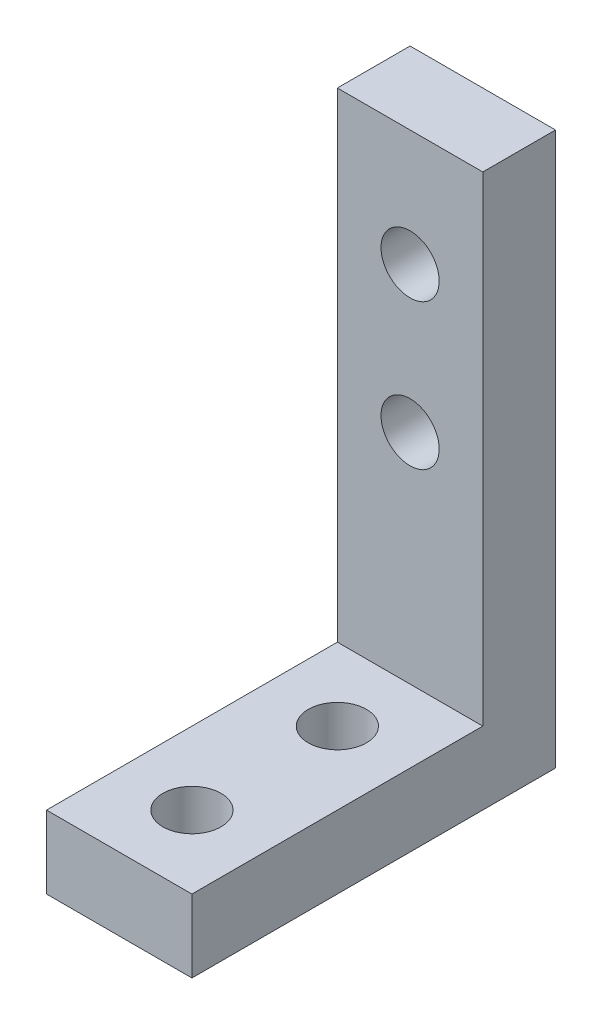
ISO-10303-21;
HEADER;
FILE_DESCRIPTION(('STEP AP214'),'2;1');
FILE_NAME('part.step','',(''),(''),'','','');
FILE_SCHEMA(('AUTOMOTIVE_DESIGN { 1 0 10303 214 1 1 1 1 }'));
ENDSEC;
DATA;
#1=APPLICATION_CONTEXT('core data for automotive mechanical design processes');
#2=APPLICATION_PROTOCOL_DEFINITION('international standard','automotive_design',2000,#1);
#3=PRODUCT_CONTEXT('',#1,'mechanical');
#4=PRODUCT('Part','Part','',(#3));
#5=PRODUCT_RELATED_PRODUCT_CATEGORY('part','',(#4));
#6=PRODUCT_DEFINITION_FORMATION('','',#4);
#7=PRODUCT_DEFINITION_CONTEXT('part definition',#1,'design');
#8=PRODUCT_DEFINITION('design','',#6,#7);
#9=PRODUCT_DEFINITION_SHAPE('','',#8);
#10=(LENGTH_UNIT() NAMED_UNIT(*) SI_UNIT(.MILLI.,.METRE.));
#11=(NAMED_UNIT(*) PLANE_ANGLE_UNIT() SI_UNIT($,.RADIAN.));
#12=(NAMED_UNIT(*) SI_UNIT($,.STERADIAN.) SOLID_ANGLE_UNIT());
#13=UNCERTAINTY_MEASURE_WITH_UNIT(LENGTH_MEASURE(1.E-05),#10,'distance_accuracy_value','');
#14=(GEOMETRIC_REPRESENTATION_CONTEXT(3) GLOBAL_UNCERTAINTY_ASSIGNED_CONTEXT((#13)) GLOBAL_UNIT_ASSIGNED_CONTEXT((#10,
#11,#12)) REPRESENTATION_CONTEXT('',''));
#15=CARTESIAN_POINT('',(0.,0.,0.));
#16=DIRECTION('',(0.,0.,1.));
#17=DIRECTION('',(1.,0.,0.));
#18=AXIS2_PLACEMENT_3D('',#15,#16,#17);
#19=CARTESIAN_POINT('',(0.,5.,0.));
#20=DIRECTION('',(0.,-1.,0.));
#21=DIRECTION('',(0.,0.,-1.));
#22=AXIS2_PLACEMENT_3D('',#19,#20,#21);
#23=PLANE('',#22);
#24=CARTESIAN_POINT('',(0.,5.,-2.5));
#25=DIRECTION('',(0.,1.,0.));
#26=DIRECTION('',(0.,0.,1.));
#27=AXIS2_PLACEMENT_3D('',#24,#25,#26);
#28=CIRCLE('',#27,2.);
#29=CARTESIAN_POINT('',(0.,5.,-0.5));
#30=VERTEX_POINT('',#29);
#31=EDGE_CURVE('E194',#30,#30,#28,.T.);
#32=ORIENTED_EDGE('',*,*,#31,.F.);
#33=EDGE_LOOP('',(#32));
#34=FACE_BOUND('',#33,.T.);
#35=CARTESIAN_POINT('',(0.,5.,7.5));
#36=DIRECTION('',(0.,1.,0.));
#37=DIRECTION('',(0.,0.,1.));
#38=AXIS2_PLACEMENT_3D('',#35,#36,#37);
#39=CIRCLE('',#38,2.);
#40=CARTESIAN_POINT('',(0.,5.,9.5));
#41=VERTEX_POINT('',#40);
#42=EDGE_CURVE('E199',#41,#41,#39,.T.);
#43=ORIENTED_EDGE('',*,*,#42,.F.);
#44=EDGE_LOOP('',(#43));
#45=FACE_BOUND('',#44,.T.);
#46=DIRECTION('',(1.,0.,0.));
#47=VECTOR('',#46,1.);
#48=CARTESIAN_POINT('',(5.,5.,-7.5));
#49=LINE('',#48,#47);
#50=CARTESIAN_POINT('',(-5.,5.,-7.5));
#51=VERTEX_POINT('',#50);
#52=CARTESIAN_POINT('',(5.,5.,-7.5));
#53=VERTEX_POINT('',#52);
#54=EDGE_CURVE('E48',#51,#53,#49,.T.);
#55=ORIENTED_EDGE('',*,*,#54,.F.);
#56=DIRECTION('',(0.,0.,1.));
#57=VECTOR('',#56,1.);
#58=CARTESIAN_POINT('',(-5.,5.,12.5));
#59=LINE('',#58,#57);
#60=CARTESIAN_POINT('',(-5.,5.,12.5));
#61=VERTEX_POINT('',#60);
#62=EDGE_CURVE('E137',#51,#61,#59,.T.);
#63=ORIENTED_EDGE('',*,*,#62,.T.);
#64=DIRECTION('',(1.,0.,0.));
#65=VECTOR('',#64,1.);
#66=CARTESIAN_POINT('',(-5.,5.,12.5));
#67=LINE('',#66,#65);
#68=CARTESIAN_POINT('',(5.,5.,12.5));
#69=VERTEX_POINT('',#68);
#70=EDGE_CURVE('E54',#61,#69,#67,.T.);
#71=ORIENTED_EDGE('',*,*,#70,.T.);
#72=DIRECTION('',(0.,0.,-1.));
#73=VECTOR('',#72,1.);
#74=CARTESIAN_POINT('',(5.,5.,12.5));
#75=LINE('',#74,#73);
#76=EDGE_CURVE('E83',#69,#53,#75,.T.);
#77=ORIENTED_EDGE('',*,*,#76,.T.);
#78=EDGE_LOOP('',(#55,#63,#71,#77));
#79=FACE_BOUND('',#78,.T.);
#80=ADVANCED_FACE('F33',(#34,#45,#79),#23,.F.);
#81=CARTESIAN_POINT('',(5.,5.,12.5));
#82=DIRECTION('',(-1.,0.,0.));
#83=DIRECTION('',(0.,0.,1.));
#84=AXIS2_PLACEMENT_3D('',#81,#82,#83);
#85=PLANE('',#84);
#86=DIRECTION('',(0.,0.,-1.));
#87=VECTOR('',#86,1.);
#88=CARTESIAN_POINT('',(5.,0.,12.5));
#89=LINE('',#88,#87);
#90=CARTESIAN_POINT('',(5.,0.,12.5));
#91=VERTEX_POINT('',#90);
#92=CARTESIAN_POINT('',(5.,0.,-12.5));
#93=VERTEX_POINT('',#92);
#94=EDGE_CURVE('E89',#91,#93,#89,.T.);
#95=ORIENTED_EDGE('',*,*,#94,.T.);
#96=DIRECTION('',(0.,-1.,0.));
#97=VECTOR('',#96,1.);
#98=CARTESIAN_POINT('',(5.,5.,-12.5));
#99=LINE('',#98,#97);
#100=CARTESIAN_POINT('',(5.,38.,-12.5));
#101=VERTEX_POINT('',#100);
#102=EDGE_CURVE('E11',#101,#93,#99,.T.);
#103=ORIENTED_EDGE('',*,*,#102,.F.);
#104=DIRECTION('',(0.,0.,-1.));
#105=VECTOR('',#104,1.);
#106=CARTESIAN_POINT('',(5.,38.,-12.5));
#107=LINE('',#106,#105);
#108=CARTESIAN_POINT('',(5.,38.,-7.5));
#109=VERTEX_POINT('',#108);
#110=EDGE_CURVE('E126',#109,#101,#107,.T.);
#111=ORIENTED_EDGE('',*,*,#110,.F.);
#112=DIRECTION('',(0.,-1.,0.));
#113=VECTOR('',#112,1.);
#114=CARTESIAN_POINT('',(5.,38.,-7.5));
#115=LINE('',#114,#113);
#116=EDGE_CURVE('E98',#109,#53,#115,.T.);
#117=ORIENTED_EDGE('',*,*,#116,.T.);
#118=ORIENTED_EDGE('',*,*,#76,.F.);
#119=DIRECTION('',(0.,-1.,0.));
#120=VECTOR('',#119,1.);
#121=CARTESIAN_POINT('',(5.,5.,12.5));
#122=LINE('',#121,#120);
#123=EDGE_CURVE('E76',#69,#91,#122,.T.);
#124=ORIENTED_EDGE('',*,*,#123,.T.);
#125=EDGE_LOOP('',(#95,#103,#111,#117,#118,#124));
#126=FACE_BOUND('',#125,.T.);
#127=ADVANCED_FACE('F35',(#126),#85,.F.);
#128=CARTESIAN_POINT('',(-5.,5.,-12.5));
#129=DIRECTION('',(0.,0.,1.));
#130=DIRECTION('',(1.,0.,0.));
#131=AXIS2_PLACEMENT_3D('',#128,#129,#130);
#132=PLANE('',#131);
#133=CARTESIAN_POINT('',(0.,30.,-12.5));
#134=DIRECTION('',(0.,0.,1.));
#135=DIRECTION('',(1.,0.,0.));
#136=AXIS2_PLACEMENT_3D('',#133,#134,#135);
#137=CIRCLE('',#136,2.);
#138=CARTESIAN_POINT('',(2.,30.,-12.5));
#139=VERTEX_POINT('',#138);
#140=EDGE_CURVE('E178',#139,#139,#137,.T.);
#141=ORIENTED_EDGE('',*,*,#140,.T.);
#142=EDGE_LOOP('',(#141));
#143=FACE_BOUND('',#142,.T.);
#144=CARTESIAN_POINT('',(0.,20.,-12.5));
#145=DIRECTION('',(0.,0.,1.));
#146=DIRECTION('',(1.,0.,0.));
#147=AXIS2_PLACEMENT_3D('',#144,#145,#146);
#148=CIRCLE('',#147,2.);
#149=CARTESIAN_POINT('',(2.,20.,-12.5));
#150=VERTEX_POINT('',#149);
#151=EDGE_CURVE('E181',#150,#150,#148,.T.);
#152=ORIENTED_EDGE('',*,*,#151,.T.);
#153=EDGE_LOOP('',(#152));
#154=FACE_BOUND('',#153,.T.);
#155=DIRECTION('',(-1.,0.,0.));
#156=VECTOR('',#155,1.);
#157=CARTESIAN_POINT('',(-5.,0.,-12.5));
#158=LINE('',#157,#156);
#159=CARTESIAN_POINT('',(-5.,0.,-12.5));
#160=VERTEX_POINT('',#159);
#161=EDGE_CURVE('E93',#93,#160,#158,.T.);
#162=ORIENTED_EDGE('',*,*,#161,.T.);
#163=DIRECTION('',(0.,-1.,0.));
#164=VECTOR('',#163,1.);
#165=CARTESIAN_POINT('',(-5.,5.,-12.5));
#166=LINE('',#165,#164);
#167=CARTESIAN_POINT('',(-5.,38.,-12.5));
#168=VERTEX_POINT('',#167);
#169=EDGE_CURVE('E41',#168,#160,#166,.T.);
#170=ORIENTED_EDGE('',*,*,#169,.F.);
#171=DIRECTION('',(-1.,0.,0.));
#172=VECTOR('',#171,1.);
#173=CARTESIAN_POINT('',(5.,38.,-12.5));
#174=LINE('',#173,#172);
#175=EDGE_CURVE('E118',#101,#168,#174,.T.);
#176=ORIENTED_EDGE('',*,*,#175,.F.);
#177=ORIENTED_EDGE('',*,*,#102,.T.);
#178=EDGE_LOOP('',(#162,#170,#176,#177));
#179=FACE_BOUND('',#178,.T.);
#180=ADVANCED_FACE('F116',(#143,#154,#179),#132,.F.);
#181=CARTESIAN_POINT('',(-5.,5.,12.5));
#182=DIRECTION('',(1.,0.,0.));
#183=DIRECTION('',(0.,0.,-1.));
#184=AXIS2_PLACEMENT_3D('',#181,#182,#183);
#185=PLANE('',#184);
#186=DIRECTION('',(0.,0.,1.));
#187=VECTOR('',#186,1.);
#188=CARTESIAN_POINT('',(-5.,0.,12.5));
#189=LINE('',#188,#187);
#190=CARTESIAN_POINT('',(-5.,0.,12.5));
#191=VERTEX_POINT('',#190);
#192=EDGE_CURVE('E84',#160,#191,#189,.T.);
#193=ORIENTED_EDGE('',*,*,#192,.T.);
#194=DIRECTION('',(0.,-1.,0.));
#195=VECTOR('',#194,1.);
#196=CARTESIAN_POINT('',(-5.,5.,12.5));
#197=LINE('',#196,#195);
#198=EDGE_CURVE('E79',#61,#191,#197,.T.);
#199=ORIENTED_EDGE('',*,*,#198,.F.);
#200=ORIENTED_EDGE('',*,*,#62,.F.);
#201=DIRECTION('',(0.,-1.,0.));
#202=VECTOR('',#201,1.);
#203=CARTESIAN_POINT('',(-5.,38.,-7.5));
#204=LINE('',#203,#202);
#205=CARTESIAN_POINT('',(-5.,38.,-7.5));
#206=VERTEX_POINT('',#205);
#207=EDGE_CURVE('E94',#206,#51,#204,.T.);
#208=ORIENTED_EDGE('',*,*,#207,.F.);
#209=DIRECTION('',(0.,0.,1.));
#210=VECTOR('',#209,1.);
#211=CARTESIAN_POINT('',(-5.,38.,-12.5));
#212=LINE('',#211,#210);
#213=EDGE_CURVE('E112',#168,#206,#212,.T.);
#214=ORIENTED_EDGE('',*,*,#213,.F.);
#215=ORIENTED_EDGE('',*,*,#169,.T.);
#216=EDGE_LOOP('',(#193,#199,#200,#208,#214,#215));
#217=FACE_BOUND('',#216,.T.);
#218=ADVANCED_FACE('F108',(#217),#185,.F.);
#219=CARTESIAN_POINT('',(-5.,5.,12.5));
#220=DIRECTION('',(0.,0.,-1.));
#221=DIRECTION('',(-1.,0.,0.));
#222=AXIS2_PLACEMENT_3D('',#219,#220,#221);
#223=PLANE('',#222);
#224=DIRECTION('',(1.,0.,0.));
#225=VECTOR('',#224,1.);
#226=CARTESIAN_POINT('',(-5.,0.,12.5));
#227=LINE('',#226,#225);
#228=EDGE_CURVE('E73',#191,#91,#227,.T.);
#229=ORIENTED_EDGE('',*,*,#228,.T.);
#230=ORIENTED_EDGE('',*,*,#123,.F.);
#231=ORIENTED_EDGE('',*,*,#70,.F.);
#232=ORIENTED_EDGE('',*,*,#198,.T.);
#233=EDGE_LOOP('',(#229,#230,#231,#232));
#234=FACE_BOUND('',#233,.T.);
#235=ADVANCED_FACE('F75',(#234),#223,.F.);
#236=CARTESIAN_POINT('',(0.,0.,0.));
#237=DIRECTION('',(0.,-1.,0.));
#238=DIRECTION('',(0.,0.,-1.));
#239=AXIS2_PLACEMENT_3D('',#236,#237,#238);
#240=PLANE('',#239);
#241=CARTESIAN_POINT('',(0.,0.,-2.5));
#242=DIRECTION('',(0.,1.,0.));
#243=DIRECTION('',(0.,0.,1.));
#244=AXIS2_PLACEMENT_3D('',#241,#242,#243);
#245=CIRCLE('',#244,2.);
#246=CARTESIAN_POINT('',(0.,0.,-0.5));
#247=VERTEX_POINT('',#246);
#248=EDGE_CURVE('E135',#247,#247,#245,.T.);
#249=ORIENTED_EDGE('',*,*,#248,.T.);
#250=EDGE_LOOP('',(#249));
#251=FACE_BOUND('',#250,.T.);
#252=CARTESIAN_POINT('',(0.,0.,7.5));
#253=DIRECTION('',(0.,1.,0.));
#254=DIRECTION('',(0.,0.,1.));
#255=AXIS2_PLACEMENT_3D('',#252,#253,#254);
#256=CIRCLE('',#255,2.);
#257=CARTESIAN_POINT('',(0.,0.,9.5));
#258=VERTEX_POINT('',#257);
#259=EDGE_CURVE('E197',#258,#258,#256,.T.);
#260=ORIENTED_EDGE('',*,*,#259,.T.);
#261=EDGE_LOOP('',(#260));
#262=FACE_BOUND('',#261,.T.);
#263=ORIENTED_EDGE('',*,*,#94,.F.);
#264=ORIENTED_EDGE('',*,*,#228,.F.);
#265=ORIENTED_EDGE('',*,*,#192,.F.);
#266=ORIENTED_EDGE('',*,*,#161,.F.);
#267=EDGE_LOOP('',(#263,#264,#265,#266));
#268=FACE_BOUND('',#267,.T.);
#269=ADVANCED_FACE('F92',(#251,#262,#268),#240,.T.);
#270=CARTESIAN_POINT('',(5.,38.,-7.5));
#271=DIRECTION('',(0.,0.,-1.));
#272=DIRECTION('',(-1.,0.,0.));
#273=AXIS2_PLACEMENT_3D('',#270,#271,#272);
#274=PLANE('',#273);
#275=CARTESIAN_POINT('',(0.,30.,-7.5));
#276=DIRECTION('',(0.,0.,1.));
#277=DIRECTION('',(1.,0.,0.));
#278=AXIS2_PLACEMENT_3D('',#275,#276,#277);
#279=CIRCLE('',#278,2.);
#280=CARTESIAN_POINT('',(2.,30.,-7.5));
#281=VERTEX_POINT('',#280);
#282=EDGE_CURVE('E183',#281,#281,#279,.T.);
#283=ORIENTED_EDGE('',*,*,#282,.F.);
#284=EDGE_LOOP('',(#283));
#285=FACE_BOUND('',#284,.T.);
#286=CARTESIAN_POINT('',(0.,20.,-7.5));
#287=DIRECTION('',(0.,0.,1.));
#288=DIRECTION('',(1.,0.,0.));
#289=AXIS2_PLACEMENT_3D('',#286,#287,#288);
#290=CIRCLE('',#289,2.);
#291=CARTESIAN_POINT('',(2.,20.,-7.5));
#292=VERTEX_POINT('',#291);
#293=EDGE_CURVE('E184',#292,#292,#290,.T.);
#294=ORIENTED_EDGE('',*,*,#293,.F.);
#295=EDGE_LOOP('',(#294));
#296=FACE_BOUND('',#295,.T.);
#297=ORIENTED_EDGE('',*,*,#54,.T.);
#298=ORIENTED_EDGE('',*,*,#116,.F.);
#299=DIRECTION('',(1.,0.,0.));
#300=VECTOR('',#299,1.);
#301=CARTESIAN_POINT('',(5.,38.,-7.5));
#302=LINE('',#301,#300);
#303=EDGE_CURVE('E128',#206,#109,#302,.T.);
#304=ORIENTED_EDGE('',*,*,#303,.F.);
#305=ORIENTED_EDGE('',*,*,#207,.T.);
#306=EDGE_LOOP('',(#297,#298,#304,#305));
#307=FACE_BOUND('',#306,.T.);
#308=ADVANCED_FACE('F140',(#285,#296,#307),#274,.F.);
#309=CARTESIAN_POINT('',(0.,38.,0.));
#310=DIRECTION('',(0.,-1.,0.));
#311=DIRECTION('',(0.,0.,-1.));
#312=AXIS2_PLACEMENT_3D('',#309,#310,#311);
#313=PLANE('',#312);
#314=ORIENTED_EDGE('',*,*,#110,.T.);
#315=ORIENTED_EDGE('',*,*,#175,.T.);
#316=ORIENTED_EDGE('',*,*,#213,.T.);
#317=ORIENTED_EDGE('',*,*,#303,.T.);
#318=EDGE_LOOP('',(#314,#315,#316,#317));
#319=FACE_BOUND('',#318,.T.);
#320=ADVANCED_FACE('F123',(#319),#313,.F.);
#321=CARTESIAN_POINT('',(0.,0.,7.5));
#322=DIRECTION('',(0.,1.,0.));
#323=DIRECTION('',(0.,0.,1.));
#324=AXIS2_PLACEMENT_3D('',#321,#322,#323);
#325=CYLINDRICAL_SURFACE('',#324,2.);
#326=ORIENTED_EDGE('',*,*,#259,.F.);
#327=EDGE_LOOP('',(#326));
#328=FACE_BOUND('',#327,.T.);
#329=ORIENTED_EDGE('',*,*,#42,.T.);
#330=EDGE_LOOP('',(#329));
#331=FACE_BOUND('',#330,.T.);
#332=ADVANCED_FACE('F153',(#328,#331),#325,.F.);
#333=CARTESIAN_POINT('',(0.,0.,-2.5));
#334=DIRECTION('',(0.,1.,0.));
#335=DIRECTION('',(0.,0.,1.));
#336=AXIS2_PLACEMENT_3D('',#333,#334,#335);
#337=CYLINDRICAL_SURFACE('',#336,2.);
#338=ORIENTED_EDGE('',*,*,#248,.F.);
#339=EDGE_LOOP('',(#338));
#340=FACE_BOUND('',#339,.T.);
#341=ORIENTED_EDGE('',*,*,#31,.T.);
#342=EDGE_LOOP('',(#341));
#343=FACE_BOUND('',#342,.T.);
#344=ADVANCED_FACE('F204',(#340,#343),#337,.F.);
#345=CARTESIAN_POINT('',(0.,20.,-12.5));
#346=DIRECTION('',(0.,0.,1.));
#347=DIRECTION('',(1.,0.,0.));
#348=AXIS2_PLACEMENT_3D('',#345,#346,#347);
#349=CYLINDRICAL_SURFACE('',#348,2.);
#350=ORIENTED_EDGE('',*,*,#151,.F.);
#351=EDGE_LOOP('',(#350));
#352=FACE_BOUND('',#351,.T.);
#353=ORIENTED_EDGE('',*,*,#293,.T.);
#354=EDGE_LOOP('',(#353));
#355=FACE_BOUND('',#354,.T.);
#356=ADVANCED_FACE('F210',(#352,#355),#349,.F.);
#357=CARTESIAN_POINT('',(0.,30.,-12.5));
#358=DIRECTION('',(0.,0.,1.));
#359=DIRECTION('',(1.,0.,0.));
#360=AXIS2_PLACEMENT_3D('',#357,#358,#359);
#361=CYLINDRICAL_SURFACE('',#360,2.);
#362=ORIENTED_EDGE('',*,*,#140,.F.);
#363=EDGE_LOOP('',(#362));
#364=FACE_BOUND('',#363,.T.);
#365=ORIENTED_EDGE('',*,*,#282,.T.);
#366=EDGE_LOOP('',(#365));
#367=FACE_BOUND('',#366,.T.);
#368=ADVANCED_FACE('F217',(#364,#367),#361,.F.);
#369=CLOSED_SHELL('',(#80,#127,#180,#218,#235,#269,#308,#320,#332,#344,#356,#368));
#370=MANIFOLD_SOLID_BREP('B2',#369);
#371=ADVANCED_BREP_SHAPE_REPRESENTATION('',(#18,#370),#14);
#372=SHAPE_DEFINITION_REPRESENTATION(#9,#371);
ENDSEC;
END-ISO-10303-21;
